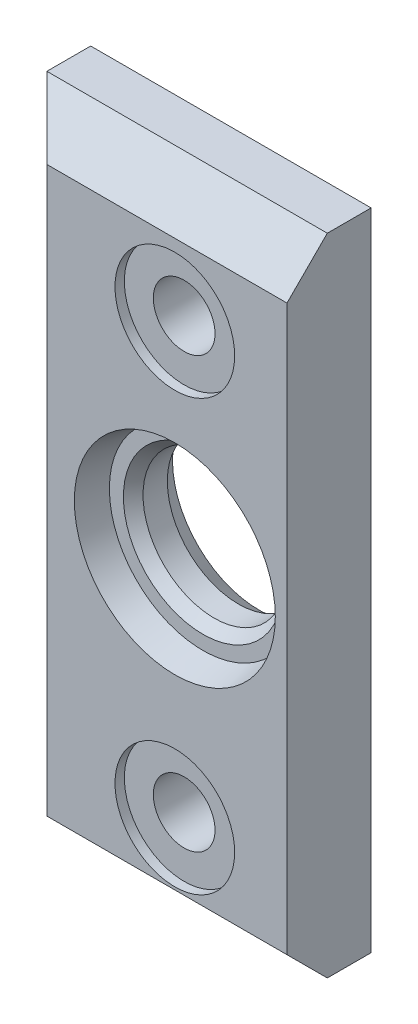
ISO-10303-21;
HEADER;
FILE_DESCRIPTION(('STEP AP214'),'2;1');
FILE_NAME('part.step','',(''),(''),'','','');
FILE_SCHEMA(('AUTOMOTIVE_DESIGN { 1 0 10303 214 1 1 1 1 }'));
ENDSEC;
DATA;
#1=APPLICATION_CONTEXT('core data for automotive mechanical design processes');
#2=APPLICATION_PROTOCOL_DEFINITION('international standard','automotive_design',2000,#1);
#3=PRODUCT_CONTEXT('',#1,'mechanical');
#4=PRODUCT('Part','Part','',(#3));
#5=PRODUCT_RELATED_PRODUCT_CATEGORY('part','',(#4));
#6=PRODUCT_DEFINITION_FORMATION('','',#4);
#7=PRODUCT_DEFINITION_CONTEXT('part definition',#1,'design');
#8=PRODUCT_DEFINITION('design','',#6,#7);
#9=PRODUCT_DEFINITION_SHAPE('','',#8);
#10=(LENGTH_UNIT() NAMED_UNIT(*) SI_UNIT(.MILLI.,.METRE.));
#11=(NAMED_UNIT(*) PLANE_ANGLE_UNIT() SI_UNIT($,.RADIAN.));
#12=(NAMED_UNIT(*) SI_UNIT($,.STERADIAN.) SOLID_ANGLE_UNIT());
#13=UNCERTAINTY_MEASURE_WITH_UNIT(LENGTH_MEASURE(1.E-05),#10,'distance_accuracy_value','');
#14=(GEOMETRIC_REPRESENTATION_CONTEXT(3) GLOBAL_UNCERTAINTY_ASSIGNED_CONTEXT((#13)) GLOBAL_UNIT_ASSIGNED_CONTEXT((#10,
#11,#12)) REPRESENTATION_CONTEXT('',''));
#15=CARTESIAN_POINT('',(0.,0.,0.));
#16=DIRECTION('',(0.,0.,1.));
#17=DIRECTION('',(1.,0.,0.));
#18=AXIS2_PLACEMENT_3D('',#15,#16,#17);
#19=CARTESIAN_POINT('',(59.,4.,64.));
#20=DIRECTION('',(0.,0.,1.));
#21=DIRECTION('',(1.,0.,0.));
#22=AXIS2_PLACEMENT_3D('',#19,#20,#21);
#23=PLANE('',#22);
#24=CARTESIAN_POINT('',(59.,4.,64.0000000000214));
#25=DIRECTION('',(0.,0.,1.));
#26=DIRECTION('',(1.,0.,0.));
#27=AXIS2_PLACEMENT_3D('',#24,#25,#26);
#28=CIRCLE('',#27,4.2500000000391);
#29=CARTESIAN_POINT('',(63.2500000000391,4.,64.0000000000214));
#30=VERTEX_POINT('',#29);
#31=EDGE_CURVE('E119',#30,#30,#28,.F.);
#32=ORIENTED_EDGE('',*,*,#31,.T.);
#33=EDGE_LOOP('',(#32));
#34=FACE_BOUND('',#33,.T.);
#35=CARTESIAN_POINT('',(59.,4.,63.9999999999645));
#36=DIRECTION('',(0.,0.,1.));
#37=DIRECTION('',(1.,0.,0.));
#38=AXIS2_PLACEMENT_3D('',#35,#36,#37);
#39=CIRCLE('',#38,4.99999999997874);
#40=CARTESIAN_POINT('',(63.9999999999787,4.,63.9999999999645));
#41=VERTEX_POINT('',#40);
#42=EDGE_CURVE('E18',#41,#41,#39,.T.);
#43=ORIENTED_EDGE('',*,*,#42,.T.);
#44=EDGE_LOOP('',(#43));
#45=FACE_BOUND('',#44,.T.);
#46=ADVANCED_FACE('F15',(#34,#45),#23,.T.);
#47=CARTESIAN_POINT('',(59.,4.,65.4999999999291));
#48=DIRECTION('',(0.,0.,1.));
#49=DIRECTION('',(1.,0.,0.));
#50=AXIS2_PLACEMENT_3D('',#47,#48,#49);
#51=CONICAL_SURFACE('',#50,5.37499999996987,0.244978663126864);
#52=ORIENTED_EDGE('',*,*,#42,.F.);
#53=EDGE_LOOP('',(#52));
#54=FACE_BOUND('',#53,.T.);
#55=CARTESIAN_POINT('',(59.,4.,65.5000000000427));
#56=DIRECTION('',(0.,0.,1.));
#57=DIRECTION('',(1.,0.,0.));
#58=AXIS2_PLACEMENT_3D('',#55,#56,#57);
#59=CIRCLE('',#58,5.37499999999829);
#60=CARTESIAN_POINT('',(64.3749999999983,4.,65.5000000000427));
#61=VERTEX_POINT('',#60);
#62=EDGE_CURVE('E84',#61,#61,#59,.T.);
#63=ORIENTED_EDGE('',*,*,#62,.T.);
#64=EDGE_LOOP('',(#63));
#65=FACE_BOUND('',#64,.T.);
#66=ADVANCED_FACE('F129',(#54,#65),#51,.F.);
#67=CARTESIAN_POINT('',(59.,15.,65.));
#68=DIRECTION('',(0.,0.,1.));
#69=DIRECTION('',(1.,0.,0.));
#70=AXIS2_PLACEMENT_3D('',#67,#68,#69);
#71=CYLINDRICAL_SURFACE('',#70,3.2);
#72=CARTESIAN_POINT('',(59.,15.,65.));
#73=DIRECTION('',(0.,0.,1.));
#74=DIRECTION('',(1.,0.,0.));
#75=AXIS2_PLACEMENT_3D('',#72,#73,#74);
#76=CIRCLE('',#75,3.2);
#77=CARTESIAN_POINT('',(62.2,15.,65.));
#78=VERTEX_POINT('',#77);
#79=EDGE_CURVE('E85',#78,#78,#76,.T.);
#80=ORIENTED_EDGE('',*,*,#79,.F.);
#81=EDGE_LOOP('',(#80));
#82=FACE_BOUND('',#81,.T.);
#83=CARTESIAN_POINT('',(59.,15.,65.5));
#84=DIRECTION('',(0.,0.,1.));
#85=DIRECTION('',(1.,0.,0.));
#86=AXIS2_PLACEMENT_3D('',#83,#84,#85);
#87=CIRCLE('',#86,3.2);
#88=CARTESIAN_POINT('',(62.2,15.,65.5));
#89=VERTEX_POINT('',#88);
#90=EDGE_CURVE('E112',#89,#89,#87,.T.);
#91=ORIENTED_EDGE('',*,*,#90,.T.);
#92=EDGE_LOOP('',(#91));
#93=FACE_BOUND('',#92,.T.);
#94=ADVANCED_FACE('F132',(#82,#93),#71,.F.);
#95=CARTESIAN_POINT('',(59.,-8.,65.));
#96=DIRECTION('',(0.,0.,1.));
#97=DIRECTION('',(1.,0.,0.));
#98=AXIS2_PLACEMENT_3D('',#95,#96,#97);
#99=CYLINDRICAL_SURFACE('',#98,3.2);
#100=CARTESIAN_POINT('',(59.,-8.,65.));
#101=DIRECTION('',(0.,0.,1.));
#102=DIRECTION('',(1.,0.,0.));
#103=AXIS2_PLACEMENT_3D('',#100,#101,#102);
#104=CIRCLE('',#103,3.2);
#105=CARTESIAN_POINT('',(62.2,-8.,65.));
#106=VERTEX_POINT('',#105);
#107=EDGE_CURVE('E121',#106,#106,#104,.T.);
#108=ORIENTED_EDGE('',*,*,#107,.F.);
#109=EDGE_LOOP('',(#108));
#110=FACE_BOUND('',#109,.T.);
#111=CARTESIAN_POINT('',(59.,-8.,65.5));
#112=DIRECTION('',(0.,0.,1.));
#113=DIRECTION('',(1.,0.,0.));
#114=AXIS2_PLACEMENT_3D('',#111,#112,#113);
#115=CIRCLE('',#114,3.2);
#116=CARTESIAN_POINT('',(62.2,-8.,65.5));
#117=VERTEX_POINT('',#116);
#118=EDGE_CURVE('E76',#117,#117,#115,.T.);
#119=ORIENTED_EDGE('',*,*,#118,.T.);
#120=EDGE_LOOP('',(#119));
#121=FACE_BOUND('',#120,.T.);
#122=ADVANCED_FACE('F269',(#110,#121),#99,.F.);
#123=CARTESIAN_POINT('',(59.,-8.,65.));
#124=DIRECTION('',(0.,0.,1.));
#125=DIRECTION('',(1.,0.,0.));
#126=AXIS2_PLACEMENT_3D('',#123,#124,#125);
#127=PLANE('',#126);
#128=CARTESIAN_POINT('',(59.,-8.,65.));
#129=DIRECTION('',(0.,0.,1.));
#130=DIRECTION('',(1.,0.,0.));
#131=AXIS2_PLACEMENT_3D('',#128,#129,#130);
#132=CIRCLE('',#131,1.65);
#133=CARTESIAN_POINT('',(60.65,-8.,65.));
#134=VERTEX_POINT('',#133);
#135=EDGE_CURVE('E107',#134,#134,#132,.F.);
#136=ORIENTED_EDGE('',*,*,#135,.T.);
#137=EDGE_LOOP('',(#136));
#138=FACE_BOUND('',#137,.T.);
#139=ORIENTED_EDGE('',*,*,#107,.T.);
#140=EDGE_LOOP('',(#139));
#141=FACE_BOUND('',#140,.T.);
#142=ADVANCED_FACE('F260',(#138,#141),#127,.T.);
#143=CARTESIAN_POINT('',(59.,4.,64.0000000000214));
#144=DIRECTION('',(0.,0.,1.));
#145=DIRECTION('',(1.,0.,0.));
#146=AXIS2_PLACEMENT_3D('',#143,#144,#145);
#147=CONICAL_SURFACE('',#146,4.2500000000391,0.643501108838759);
#148=ORIENTED_EDGE('',*,*,#31,.F.);
#149=EDGE_LOOP('',(#148));
#150=FACE_BOUND('',#149,.T.);
#151=CARTESIAN_POINT('',(59.,4.,63.4));
#152=DIRECTION('',(0.,0.,1.));
#153=DIRECTION('',(1.,0.,0.));
#154=AXIS2_PLACEMENT_3D('',#151,#152,#153);
#155=CIRCLE('',#154,3.8);
#156=CARTESIAN_POINT('',(62.8,4.,63.4));
#157=VERTEX_POINT('',#156);
#158=EDGE_CURVE('E106',#157,#157,#155,.F.);
#159=ORIENTED_EDGE('',*,*,#158,.T.);
#160=EDGE_LOOP('',(#159));
#161=FACE_BOUND('',#160,.T.);
#162=ADVANCED_FACE('F258',(#150,#161),#147,.F.);
#163=CARTESIAN_POINT('',(59.,15.,65.));
#164=DIRECTION('',(0.,0.,1.));
#165=DIRECTION('',(1.,0.,0.));
#166=AXIS2_PLACEMENT_3D('',#163,#164,#165);
#167=PLANE('',#166);
#168=CARTESIAN_POINT('',(59.,15.,65.));
#169=DIRECTION('',(0.,0.,1.));
#170=DIRECTION('',(1.,0.,0.));
#171=AXIS2_PLACEMENT_3D('',#168,#169,#170);
#172=CIRCLE('',#171,1.65);
#173=CARTESIAN_POINT('',(60.65,15.,65.));
#174=VERTEX_POINT('',#173);
#175=EDGE_CURVE('E102',#174,#174,#172,.F.);
#176=ORIENTED_EDGE('',*,*,#175,.T.);
#177=EDGE_LOOP('',(#176));
#178=FACE_BOUND('',#177,.T.);
#179=ORIENTED_EDGE('',*,*,#79,.T.);
#180=EDGE_LOOP('',(#179));
#181=FACE_BOUND('',#180,.T.);
#182=ADVANCED_FACE('F145',(#178,#181),#167,.T.);
#183=CARTESIAN_POINT('',(47.828427124746,-15.,61.171572875254));
#184=DIRECTION('',(0.707106781186548,0.,-0.707106781186548));
#185=DIRECTION('',(-0.707106781186548,0.,-0.707106781186548));
#186=AXIS2_PLACEMENT_3D('',#183,#184,#185);
#187=PLANE('',#186);
#188=DIRECTION('',(-0.577350269189626,0.577350269189626,-0.577350269189626));
#189=VECTOR('',#188,1.);
#190=CARTESIAN_POINT('',(52.156854249492,18.843145750508,65.5));
#191=LINE('',#190,#189);
#192=CARTESIAN_POINT('',(52.156854249492,18.843145750508,65.5));
#193=VERTEX_POINT('',#192);
#194=CARTESIAN_POINT('',(50.,21.,63.343145750508));
#195=VERTEX_POINT('',#194);
#196=EDGE_CURVE('E91',#193,#195,#191,.T.);
#197=ORIENTED_EDGE('',*,*,#196,.T.);
#198=DIRECTION('',(0.,1.,0.));
#199=VECTOR('',#198,1.);
#200=CARTESIAN_POINT('',(50.,-13.5,63.343145750508));
#201=LINE('',#200,#199);
#202=CARTESIAN_POINT('',(50.,-13.499999999999,63.343145750507));
#203=VERTEX_POINT('',#202);
#204=EDGE_CURVE('E71',#195,#203,#201,.F.);
#205=ORIENTED_EDGE('',*,*,#204,.T.);
#206=DIRECTION('',(0.577350269188912,0.577350269189983,0.577350269189982));
#207=VECTOR('',#206,1.);
#208=CARTESIAN_POINT('',(50.,-13.499999999998,63.343145750506));
#209=LINE('',#208,#207);
#210=CARTESIAN_POINT('',(52.156854249492,-11.3431457505005,65.5000000000005));
#211=VERTEX_POINT('',#210);
#212=EDGE_CURVE('E68',#203,#211,#209,.T.);
#213=ORIENTED_EDGE('',*,*,#212,.T.);
#214=DIRECTION('',(0.,1.,0.));
#215=VECTOR('',#214,1.);
#216=CARTESIAN_POINT('',(52.156854249492,-13.5,65.5));
#217=LINE('',#216,#215);
#218=EDGE_CURVE('E65',#211,#193,#217,.T.);
#219=ORIENTED_EDGE('',*,*,#218,.T.);
#220=EDGE_LOOP('',(#197,#205,#213,#219));
#221=FACE_BOUND('',#220,.T.);
#222=ADVANCED_FACE('F69',(#221),#187,.F.);
#223=CARTESIAN_POINT('',(50.,-13.5,65.5));
#224=DIRECTION('',(0.,0.,-1.));
#225=DIRECTION('',(0.,1.,0.));
#226=AXIS2_PLACEMENT_3D('',#223,#224,#225);
#227=PLANE('',#226);
#228=ORIENTED_EDGE('',*,*,#118,.F.);
#229=EDGE_LOOP('',(#228));
#230=FACE_BOUND('',#229,.T.);
#231=ORIENTED_EDGE('',*,*,#90,.F.);
#232=EDGE_LOOP('',(#231));
#233=FACE_BOUND('',#232,.T.);
#234=ORIENTED_EDGE('',*,*,#62,.F.);
#235=EDGE_LOOP('',(#234));
#236=FACE_BOUND('',#235,.T.);
#237=ORIENTED_EDGE('',*,*,#218,.F.);
#238=DIRECTION('',(1.,0.,0.));
#239=VECTOR('',#238,1.);
#240=CARTESIAN_POINT('',(45.,-11.343145750502,65.500000000002));
#241=LINE('',#240,#239);
#242=CARTESIAN_POINT('',(65.,-11.3431457505005,65.5000000000005));
#243=VERTEX_POINT('',#242);
#244=EDGE_CURVE('E75',#211,#243,#241,.T.);
#245=ORIENTED_EDGE('',*,*,#244,.T.);
#246=DIRECTION('',(0.,1.,0.));
#247=VECTOR('',#246,1.);
#248=CARTESIAN_POINT('',(65.,-13.5,65.5));
#249=LINE('',#248,#247);
#250=CARTESIAN_POINT('',(65.,18.843145750508,65.5));
#251=VERTEX_POINT('',#250);
#252=EDGE_CURVE('E217',#251,#243,#249,.F.);
#253=ORIENTED_EDGE('',*,*,#252,.F.);
#254=DIRECTION('',(1.,0.,0.));
#255=VECTOR('',#254,1.);
#256=CARTESIAN_POINT('',(45.,18.843145750508,65.5));
#257=LINE('',#256,#255);
#258=EDGE_CURVE('E82',#251,#193,#257,.F.);
#259=ORIENTED_EDGE('',*,*,#258,.T.);
#260=EDGE_LOOP('',(#237,#245,#253,#259));
#261=FACE_BOUND('',#260,.T.);
#262=ADVANCED_FACE('F79',(#230,#233,#236,#261),#227,.F.);
#263=CARTESIAN_POINT('',(45.,-15.67157287525,61.171572875254));
#264=DIRECTION('',(0.,0.707106781186548,-0.707106781186548));
#265=DIRECTION('',(0.,0.707106781186548,0.707106781186548));
#266=AXIS2_PLACEMENT_3D('',#263,#264,#265);
#267=PLANE('',#266);
#268=ORIENTED_EDGE('',*,*,#244,.F.);
#269=ORIENTED_EDGE('',*,*,#212,.F.);
#270=DIRECTION('',(1.,0.,0.));
#271=VECTOR('',#270,1.);
#272=CARTESIAN_POINT('',(50.,-13.5,63.343145750508));
#273=LINE('',#272,#271);
#274=CARTESIAN_POINT('',(65.,-13.499999999999,63.343145750507));
#275=VERTEX_POINT('',#274);
#276=EDGE_CURVE('E105',#203,#275,#273,.T.);
#277=ORIENTED_EDGE('',*,*,#276,.T.);
#278=DIRECTION('',(0.,-0.70710678118786,-0.707106781185236));
#279=VECTOR('',#278,1.);
#280=CARTESIAN_POINT('',(65.,-11.3431457505,65.5));
#281=LINE('',#280,#279);
#282=EDGE_CURVE('E89',#243,#275,#281,.T.);
#283=ORIENTED_EDGE('',*,*,#282,.F.);
#284=EDGE_LOOP('',(#268,#269,#277,#283));
#285=FACE_BOUND('',#284,.T.);
#286=ADVANCED_FACE('F87',(#285),#267,.F.);
#287=CARTESIAN_POINT('',(45.,16.171572875254,68.171572875254));
#288=DIRECTION('',(0.,-0.707106781186548,-0.707106781186548));
#289=DIRECTION('',(0.,0.707106781186548,-0.707106781186548));
#290=AXIS2_PLACEMENT_3D('',#287,#288,#289);
#291=PLANE('',#290);
#292=DIRECTION('',(0.,-0.707106781186549,0.707106781186546));
#293=VECTOR('',#292,1.);
#294=CARTESIAN_POINT('',(65.,21.,63.343145750508));
#295=LINE('',#294,#293);
#296=CARTESIAN_POINT('',(65.,21.,63.343145750508));
#297=VERTEX_POINT('',#296);
#298=EDGE_CURVE('E203',#297,#251,#295,.T.);
#299=ORIENTED_EDGE('',*,*,#298,.F.);
#300=DIRECTION('',(1.,0.,0.));
#301=VECTOR('',#300,1.);
#302=CARTESIAN_POINT('',(50.,21.,63.343145750508));
#303=LINE('',#302,#301);
#304=EDGE_CURVE('E204',#195,#297,#303,.T.);
#305=ORIENTED_EDGE('',*,*,#304,.F.);
#306=ORIENTED_EDGE('',*,*,#196,.F.);
#307=ORIENTED_EDGE('',*,*,#258,.F.);
#308=EDGE_LOOP('',(#299,#305,#306,#307));
#309=FACE_BOUND('',#308,.T.);
#310=ADVANCED_FACE('F143',(#309),#291,.F.);
#311=CARTESIAN_POINT('',(59.,-8.,48.));
#312=DIRECTION('',(0.,0.,1.));
#313=DIRECTION('',(1.,0.,0.));
#314=AXIS2_PLACEMENT_3D('',#311,#312,#313);
#315=CYLINDRICAL_SURFACE('',#314,1.65);
#316=ORIENTED_EDGE('',*,*,#135,.F.);
#317=EDGE_LOOP('',(#316));
#318=FACE_BOUND('',#317,.T.);
#319=CARTESIAN_POINT('',(59.,-8.,61.5000000000236));
#320=DIRECTION('',(0.,0.,-1.));
#321=DIRECTION('',(1.,0.,0.));
#322=AXIS2_PLACEMENT_3D('',#319,#320,#321);
#323=CIRCLE('',#322,1.64999999995279);
#324=CARTESIAN_POINT('',(60.6499999999528,-8.,61.5000000000236));
#325=VERTEX_POINT('',#324);
#326=EDGE_CURVE('E206',#325,#325,#323,.T.);
#327=ORIENTED_EDGE('',*,*,#326,.T.);
#328=EDGE_LOOP('',(#327));
#329=FACE_BOUND('',#328,.T.);
#330=ADVANCED_FACE('F191',(#318,#329),#315,.F.);
#331=CARTESIAN_POINT('',(59.,4.,60.));
#332=DIRECTION('',(0.,0.,1.));
#333=DIRECTION('',(1.,0.,0.));
#334=AXIS2_PLACEMENT_3D('',#331,#332,#333);
#335=CYLINDRICAL_SURFACE('',#334,3.8);
#336=ORIENTED_EDGE('',*,*,#158,.F.);
#337=EDGE_LOOP('',(#336));
#338=FACE_BOUND('',#337,.T.);
#339=CARTESIAN_POINT('',(59.,4.,62.0999999999867));
#340=DIRECTION('',(0.,0.,-1.));
#341=DIRECTION('',(1.,0.,0.));
#342=AXIS2_PLACEMENT_3D('',#339,#340,#341);
#343=CIRCLE('',#342,3.79999999998153);
#344=CARTESIAN_POINT('',(62.7999999999815,4.,62.0999999999867));
#345=VERTEX_POINT('',#344);
#346=EDGE_CURVE('E230',#345,#345,#343,.T.);
#347=ORIENTED_EDGE('',*,*,#346,.T.);
#348=EDGE_LOOP('',(#347));
#349=FACE_BOUND('',#348,.T.);
#350=ADVANCED_FACE('F187',(#338,#349),#335,.F.);
#351=CARTESIAN_POINT('',(59.,15.,48.));
#352=DIRECTION('',(0.,0.,1.));
#353=DIRECTION('',(1.,0.,0.));
#354=AXIS2_PLACEMENT_3D('',#351,#352,#353);
#355=CYLINDRICAL_SURFACE('',#354,1.65);
#356=ORIENTED_EDGE('',*,*,#175,.F.);
#357=EDGE_LOOP('',(#356));
#358=FACE_BOUND('',#357,.T.);
#359=CARTESIAN_POINT('',(59.,15.,61.5000000000236));
#360=DIRECTION('',(0.,0.,-1.));
#361=DIRECTION('',(1.,0.,0.));
#362=AXIS2_PLACEMENT_3D('',#359,#360,#361);
#363=CIRCLE('',#362,1.64999999995279);
#364=CARTESIAN_POINT('',(60.6499999999528,15.,61.5000000000236));
#365=VERTEX_POINT('',#364);
#366=EDGE_CURVE('E226',#365,#365,#363,.T.);
#367=ORIENTED_EDGE('',*,*,#366,.T.);
#368=EDGE_LOOP('',(#367));
#369=FACE_BOUND('',#368,.T.);
#370=ADVANCED_FACE('F183',(#358,#369),#355,.F.);
#371=CARTESIAN_POINT('',(50.,-13.5,65.5));
#372=DIRECTION('',(0.,1.,0.));
#373=DIRECTION('',(0.,0.,1.));
#374=AXIS2_PLACEMENT_3D('',#371,#372,#373);
#375=PLANE('',#374);
#376=DIRECTION('',(0.,0.,-1.));
#377=VECTOR('',#376,1.);
#378=CARTESIAN_POINT('',(65.,-13.5,65.5));
#379=LINE('',#378,#377);
#380=CARTESIAN_POINT('',(65.,-13.5,61.));
#381=VERTEX_POINT('',#380);
#382=EDGE_CURVE('E211',#275,#381,#379,.T.);
#383=ORIENTED_EDGE('',*,*,#382,.F.);
#384=ORIENTED_EDGE('',*,*,#276,.F.);
#385=DIRECTION('',(0.,0.,-1.));
#386=VECTOR('',#385,1.);
#387=CARTESIAN_POINT('',(50.,-13.5,65.5));
#388=LINE('',#387,#386);
#389=CARTESIAN_POINT('',(50.,-13.5,61.));
#390=VERTEX_POINT('',#389);
#391=EDGE_CURVE('E222',#203,#390,#388,.T.);
#392=ORIENTED_EDGE('',*,*,#391,.T.);
#393=DIRECTION('',(1.,0.,0.));
#394=VECTOR('',#393,1.);
#395=CARTESIAN_POINT('',(50.,-13.5,61.));
#396=LINE('',#395,#394);
#397=EDGE_CURVE('E229',#381,#390,#396,.F.);
#398=ORIENTED_EDGE('',*,*,#397,.F.);
#399=EDGE_LOOP('',(#383,#384,#392,#398));
#400=FACE_BOUND('',#399,.T.);
#401=ADVANCED_FACE('F179',(#400),#375,.F.);
#402=CARTESIAN_POINT('',(50.,-13.5,65.5));
#403=DIRECTION('',(1.,0.,0.));
#404=DIRECTION('',(0.,0.,-1.));
#405=AXIS2_PLACEMENT_3D('',#402,#403,#404);
#406=PLANE('',#405);
#407=ORIENTED_EDGE('',*,*,#391,.F.);
#408=ORIENTED_EDGE('',*,*,#204,.F.);
#409=DIRECTION('',(0.,0.,1.));
#410=VECTOR('',#409,1.);
#411=CARTESIAN_POINT('',(50.,21.,65.5));
#412=LINE('',#411,#410);
#413=CARTESIAN_POINT('',(50.,21.,61.));
#414=VERTEX_POINT('',#413);
#415=EDGE_CURVE('E220',#414,#195,#412,.T.);
#416=ORIENTED_EDGE('',*,*,#415,.F.);
#417=DIRECTION('',(0.,1.,0.));
#418=VECTOR('',#417,1.);
#419=CARTESIAN_POINT('',(50.,-13.5,61.));
#420=LINE('',#419,#418);
#421=EDGE_CURVE('E246',#390,#414,#420,.T.);
#422=ORIENTED_EDGE('',*,*,#421,.F.);
#423=EDGE_LOOP('',(#407,#408,#416,#422));
#424=FACE_BOUND('',#423,.T.);
#425=ADVANCED_FACE('F176',(#424),#406,.F.);
#426=CARTESIAN_POINT('',(50.,21.,65.5));
#427=DIRECTION('',(0.,1.,0.));
#428=DIRECTION('',(0.,0.,1.));
#429=AXIS2_PLACEMENT_3D('',#426,#427,#428);
#430=PLANE('',#429);
#431=DIRECTION('',(0.,0.,-1.));
#432=VECTOR('',#431,1.);
#433=CARTESIAN_POINT('',(65.,21.,65.5));
#434=LINE('',#433,#432);
#435=CARTESIAN_POINT('',(65.,21.,61.));
#436=VERTEX_POINT('',#435);
#437=EDGE_CURVE('E33',#436,#297,#434,.F.);
#438=ORIENTED_EDGE('',*,*,#437,.F.);
#439=DIRECTION('',(1.,0.,0.));
#440=VECTOR('',#439,1.);
#441=CARTESIAN_POINT('',(50.,21.,61.));
#442=LINE('',#441,#440);
#443=EDGE_CURVE('E243',#414,#436,#442,.T.);
#444=ORIENTED_EDGE('',*,*,#443,.F.);
#445=ORIENTED_EDGE('',*,*,#415,.T.);
#446=ORIENTED_EDGE('',*,*,#304,.T.);
#447=EDGE_LOOP('',(#438,#444,#445,#446));
#448=FACE_BOUND('',#447,.T.);
#449=ADVANCED_FACE('F172',(#448),#430,.T.);
#450=CARTESIAN_POINT('',(65.,-13.5,65.5));
#451=DIRECTION('',(1.,0.,0.));
#452=DIRECTION('',(0.,0.,-1.));
#453=AXIS2_PLACEMENT_3D('',#450,#451,#452);
#454=PLANE('',#453);
#455=ORIENTED_EDGE('',*,*,#437,.T.);
#456=ORIENTED_EDGE('',*,*,#298,.T.);
#457=ORIENTED_EDGE('',*,*,#252,.T.);
#458=ORIENTED_EDGE('',*,*,#282,.T.);
#459=ORIENTED_EDGE('',*,*,#382,.T.);
#460=DIRECTION('',(0.,1.,0.));
#461=VECTOR('',#460,1.);
#462=CARTESIAN_POINT('',(65.,-13.5,61.));
#463=LINE('',#462,#461);
#464=EDGE_CURVE('E101',#436,#381,#463,.F.);
#465=ORIENTED_EDGE('',*,*,#464,.F.);
#466=EDGE_LOOP('',(#455,#456,#457,#458,#459,#465));
#467=FACE_BOUND('',#466,.T.);
#468=ADVANCED_FACE('F168',(#467),#454,.T.);
#469=CARTESIAN_POINT('',(59.,-8.,61.000000000206));
#470=DIRECTION('',(0.,0.,-1.));
#471=DIRECTION('',(-1.,0.,0.));
#472=AXIS2_PLACEMENT_3D('',#469,#470,#471);
#473=CONICAL_SURFACE('',#472,1.93333333319606,0.515549007370057);
#474=ORIENTED_EDGE('',*,*,#326,.F.);
#475=EDGE_LOOP('',(#474));
#476=FACE_BOUND('',#475,.T.);
#477=CARTESIAN_POINT('',(59.,-8.,61.0000000000355));
#478=DIRECTION('',(0.,0.,-1.));
#479=DIRECTION('',(-1.,0.,0.));
#480=AXIS2_PLACEMENT_3D('',#477,#478,#479);
#481=CIRCLE('',#480,1.93333333329269);
#482=CARTESIAN_POINT('',(57.0666666667073,-8.,61.0000000000355));
#483=VERTEX_POINT('',#482);
#484=EDGE_CURVE('E98',#483,#483,#481,.F.);
#485=ORIENTED_EDGE('',*,*,#484,.F.);
#486=EDGE_LOOP('',(#485));
#487=FACE_BOUND('',#486,.T.);
#488=ADVANCED_FACE('F164',(#476,#487),#473,.F.);
#489=CARTESIAN_POINT('',(59.,4.,60.9999999999786));
#490=DIRECTION('',(0.,0.,-1.));
#491=DIRECTION('',(-1.,0.,0.));
#492=AXIS2_PLACEMENT_3D('',#489,#490,#491);
#493=CONICAL_SURFACE('',#492,4.62500000000182,0.643501108801553);
#494=ORIENTED_EDGE('',*,*,#346,.F.);
#495=EDGE_LOOP('',(#494));
#496=FACE_BOUND('',#495,.T.);
#497=CARTESIAN_POINT('',(59.,4.,60.9999999999786));
#498=DIRECTION('',(0.,0.,-1.));
#499=DIRECTION('',(-1.,0.,0.));
#500=AXIS2_PLACEMENT_3D('',#497,#498,#499);
#501=CIRCLE('',#500,4.62500000000182);
#502=CARTESIAN_POINT('',(54.3749999999982,4.,60.9999999999786));
#503=VERTEX_POINT('',#502);
#504=EDGE_CURVE('E24',#503,#503,#501,.F.);
#505=ORIENTED_EDGE('',*,*,#504,.F.);
#506=EDGE_LOOP('',(#505));
#507=FACE_BOUND('',#506,.T.);
#508=ADVANCED_FACE('F157',(#496,#507),#493,.F.);
#509=CARTESIAN_POINT('',(59.,15.,61.000000000206));
#510=DIRECTION('',(0.,0.,-1.));
#511=DIRECTION('',(-1.,0.,0.));
#512=AXIS2_PLACEMENT_3D('',#509,#510,#511);
#513=CONICAL_SURFACE('',#512,1.93333333319606,0.515549007370057);
#514=ORIENTED_EDGE('',*,*,#366,.F.);
#515=EDGE_LOOP('',(#514));
#516=FACE_BOUND('',#515,.T.);
#517=CARTESIAN_POINT('',(59.,15.,61.0000000000355));
#518=DIRECTION('',(0.,0.,-1.));
#519=DIRECTION('',(-1.,0.,0.));
#520=AXIS2_PLACEMENT_3D('',#517,#518,#519);
#521=CIRCLE('',#520,1.93333333329269);
#522=CARTESIAN_POINT('',(57.0666666667073,15.,61.0000000000355));
#523=VERTEX_POINT('',#522);
#524=EDGE_CURVE('E10',#523,#523,#521,.F.);
#525=ORIENTED_EDGE('',*,*,#524,.F.);
#526=EDGE_LOOP('',(#525));
#527=FACE_BOUND('',#526,.T.);
#528=ADVANCED_FACE('F151',(#516,#527),#513,.F.);
#529=CARTESIAN_POINT('',(50.,-13.5,61.));
#530=DIRECTION('',(0.,0.,-1.));
#531=DIRECTION('',(0.,1.,0.));
#532=AXIS2_PLACEMENT_3D('',#529,#530,#531);
#533=PLANE('',#532);
#534=ORIENTED_EDGE('',*,*,#524,.T.);
#535=EDGE_LOOP('',(#534));
#536=FACE_BOUND('',#535,.T.);
#537=ORIENTED_EDGE('',*,*,#504,.T.);
#538=EDGE_LOOP('',(#537));
#539=FACE_BOUND('',#538,.T.);
#540=ORIENTED_EDGE('',*,*,#484,.T.);
#541=EDGE_LOOP('',(#540));
#542=FACE_BOUND('',#541,.T.);
#543=ORIENTED_EDGE('',*,*,#443,.T.);
#544=ORIENTED_EDGE('',*,*,#464,.T.);
#545=ORIENTED_EDGE('',*,*,#397,.T.);
#546=ORIENTED_EDGE('',*,*,#421,.T.);
#547=EDGE_LOOP('',(#543,#544,#545,#546));
#548=FACE_BOUND('',#547,.T.);
#549=ADVANCED_FACE('F149',(#536,#539,#542,#548),#533,.T.);
#550=CLOSED_SHELL('',(#46,#66,#94,#122,#142,#162,#182,#222,#262,#286,#310,#330,#350,#370,#401,
#425,#449,#468,#488,#508,#528,#549));
#551=MANIFOLD_SOLID_BREP('B1',#550);
#552=ADVANCED_BREP_SHAPE_REPRESENTATION('',(#18,#551),#14);
#553=SHAPE_DEFINITION_REPRESENTATION(#9,#552);
ENDSEC;
END-ISO-10303-21;
